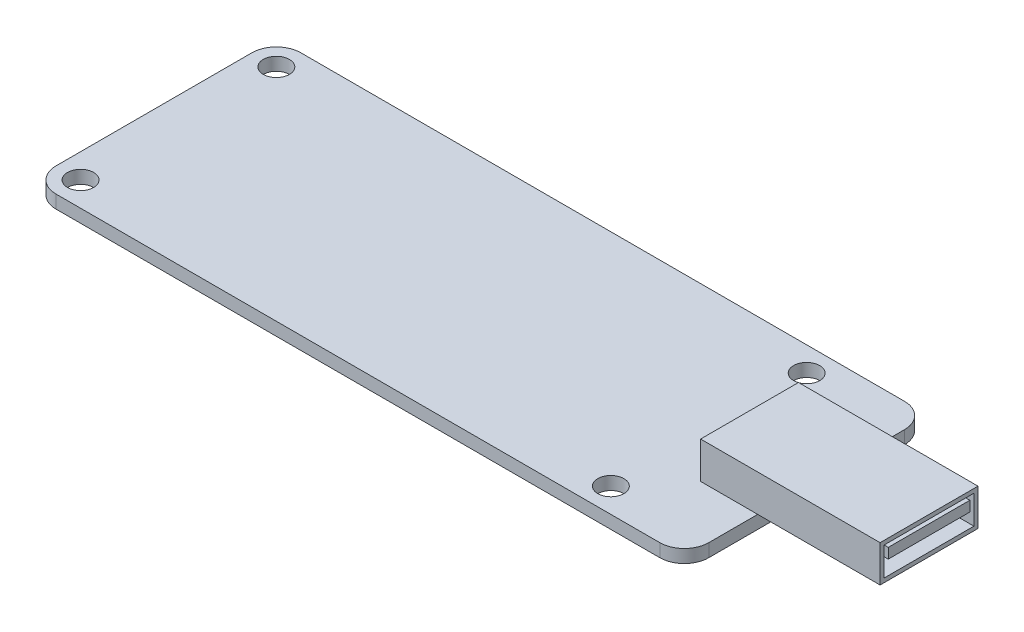
ISO-10303-21;
HEADER;
FILE_DESCRIPTION(('STEP AP214'),'2;1');
FILE_NAME('part.step','',(''),(''),'','','');
FILE_SCHEMA(('AUTOMOTIVE_DESIGN { 1 0 10303 214 1 1 1 1 }'));
ENDSEC;
DATA;
#1=APPLICATION_CONTEXT('core data for automotive mechanical design processes');
#2=APPLICATION_PROTOCOL_DEFINITION('international standard','automotive_design',2000,#1);
#3=PRODUCT_CONTEXT('',#1,'mechanical');
#4=PRODUCT('Part','Part','',(#3));
#5=PRODUCT_RELATED_PRODUCT_CATEGORY('part','',(#4));
#6=PRODUCT_DEFINITION_FORMATION('','',#4);
#7=PRODUCT_DEFINITION_CONTEXT('part definition',#1,'design');
#8=PRODUCT_DEFINITION('design','',#6,#7);
#9=PRODUCT_DEFINITION_SHAPE('','',#8);
#10=(LENGTH_UNIT() NAMED_UNIT(*) SI_UNIT(.MILLI.,.METRE.));
#11=(NAMED_UNIT(*) PLANE_ANGLE_UNIT() SI_UNIT($,.RADIAN.));
#12=(NAMED_UNIT(*) SI_UNIT($,.STERADIAN.) SOLID_ANGLE_UNIT());
#13=UNCERTAINTY_MEASURE_WITH_UNIT(LENGTH_MEASURE(1.E-05),#10,'distance_accuracy_value','');
#14=(GEOMETRIC_REPRESENTATION_CONTEXT(3) GLOBAL_UNCERTAINTY_ASSIGNED_CONTEXT((#13)) GLOBAL_UNIT_ASSIGNED_CONTEXT((#10,
#11,#12)) REPRESENTATION_CONTEXT('',''));
#15=CARTESIAN_POINT('',(0.,0.,0.));
#16=DIRECTION('',(0.,0.,1.));
#17=DIRECTION('',(1.,0.,0.));
#18=AXIS2_PLACEMENT_3D('',#15,#16,#17);
#19=CARTESIAN_POINT('',(40.,1.6,-15.));
#20=DIRECTION('',(-1.,0.,0.));
#21=DIRECTION('',(0.,0.,1.));
#22=AXIS2_PLACEMENT_3D('',#19,#20,#21);
#23=PLANE('',#22);
#24=DIRECTION('',(0.,0.,-1.));
#25=VECTOR('',#24,1.);
#26=CARTESIAN_POINT('',(40.,1.6,-15.));
#27=LINE('',#26,#25);
#28=CARTESIAN_POINT('',(40.,1.6,12.));
#29=VERTEX_POINT('',#28);
#30=CARTESIAN_POINT('',(40.,1.6,6.));
#31=VERTEX_POINT('',#30);
#32=EDGE_CURVE('E413',#29,#31,#27,.T.);
#33=ORIENTED_EDGE('',*,*,#32,.F.);
#34=DIRECTION('',(0.,-1.,0.));
#35=VECTOR('',#34,1.);
#36=CARTESIAN_POINT('',(40.,1.6,12.));
#37=LINE('',#36,#35);
#38=CARTESIAN_POINT('',(40.,0.,12.));
#39=VERTEX_POINT('',#38);
#40=EDGE_CURVE('E439',#29,#39,#37,.T.);
#41=ORIENTED_EDGE('',*,*,#40,.T.);
#42=DIRECTION('',(0.,0.,-1.));
#43=VECTOR('',#42,1.);
#44=CARTESIAN_POINT('',(40.,0.,-15.));
#45=LINE('',#44,#43);
#46=CARTESIAN_POINT('',(40.,0.,-12.));
#47=VERTEX_POINT('',#46);
#48=EDGE_CURVE('E412',#39,#47,#45,.T.);
#49=ORIENTED_EDGE('',*,*,#48,.T.);
#50=DIRECTION('',(0.,-1.,0.));
#51=VECTOR('',#50,1.);
#52=CARTESIAN_POINT('',(40.,1.6,-12.));
#53=LINE('',#52,#51);
#54=CARTESIAN_POINT('',(40.,1.6,-12.));
#55=VERTEX_POINT('',#54);
#56=EDGE_CURVE('E437',#47,#55,#53,.F.);
#57=ORIENTED_EDGE('',*,*,#56,.T.);
#58=CARTESIAN_POINT('',(40.,1.6,-6.));
#59=VERTEX_POINT('',#58);
#60=EDGE_CURVE('E417',#59,#55,#27,.T.);
#61=ORIENTED_EDGE('',*,*,#60,.F.);
#62=EDGE_CURVE('E416',#31,#59,#27,.T.);
#63=ORIENTED_EDGE('',*,*,#62,.F.);
#64=EDGE_LOOP('',(#33,#41,#49,#57,#61,#63));
#65=FACE_BOUND('',#64,.T.);
#66=ADVANCED_FACE('F35',(#65),#23,.F.);
#67=CARTESIAN_POINT('',(-40.,1.6,-15.));
#68=DIRECTION('',(0.,0.,1.));
#69=DIRECTION('',(1.,0.,0.));
#70=AXIS2_PLACEMENT_3D('',#67,#68,#69);
#71=PLANE('',#70);
#72=DIRECTION('',(-1.,0.,0.));
#73=VECTOR('',#72,1.);
#74=CARTESIAN_POINT('',(-40.,1.6,-15.));
#75=LINE('',#74,#73);
#76=CARTESIAN_POINT('',(37.,1.6,-15.));
#77=VERTEX_POINT('',#76);
#78=CARTESIAN_POINT('',(-37.,1.6,-15.));
#79=VERTEX_POINT('',#78);
#80=EDGE_CURVE('E415',#77,#79,#75,.T.);
#81=ORIENTED_EDGE('',*,*,#80,.F.);
#82=DIRECTION('',(0.,-1.,0.));
#83=VECTOR('',#82,1.);
#84=CARTESIAN_POINT('',(37.,1.6,-15.));
#85=LINE('',#84,#83);
#86=CARTESIAN_POINT('',(37.,0.,-15.));
#87=VERTEX_POINT('',#86);
#88=EDGE_CURVE('E465',#77,#87,#85,.T.);
#89=ORIENTED_EDGE('',*,*,#88,.T.);
#90=DIRECTION('',(-1.,0.,0.));
#91=VECTOR('',#90,1.);
#92=CARTESIAN_POINT('',(-40.,0.,-15.));
#93=LINE('',#92,#91);
#94=CARTESIAN_POINT('',(-37.,0.,-15.));
#95=VERTEX_POINT('',#94);
#96=EDGE_CURVE('E428',#87,#95,#93,.T.);
#97=ORIENTED_EDGE('',*,*,#96,.T.);
#98=DIRECTION('',(0.,-1.,0.));
#99=VECTOR('',#98,1.);
#100=CARTESIAN_POINT('',(-37.,1.6,-15.));
#101=LINE('',#100,#99);
#102=EDGE_CURVE('E463',#95,#79,#101,.F.);
#103=ORIENTED_EDGE('',*,*,#102,.T.);
#104=EDGE_LOOP('',(#81,#89,#97,#103));
#105=FACE_BOUND('',#104,.T.);
#106=ADVANCED_FACE('F534',(#105),#71,.F.);
#107=CARTESIAN_POINT('',(-40.,1.6,-15.));
#108=DIRECTION('',(1.,0.,0.));
#109=DIRECTION('',(0.,0.,-1.));
#110=AXIS2_PLACEMENT_3D('',#107,#108,#109);
#111=PLANE('',#110);
#112=DIRECTION('',(0.,0.,1.));
#113=VECTOR('',#112,1.);
#114=CARTESIAN_POINT('',(-40.,1.6,-15.));
#115=LINE('',#114,#113);
#116=CARTESIAN_POINT('',(-40.,1.6,-12.));
#117=VERTEX_POINT('',#116);
#118=CARTESIAN_POINT('',(-40.,1.6,12.));
#119=VERTEX_POINT('',#118);
#120=EDGE_CURVE('E420',#117,#119,#115,.T.);
#121=ORIENTED_EDGE('',*,*,#120,.F.);
#122=DIRECTION('',(0.,-1.,0.));
#123=VECTOR('',#122,1.);
#124=CARTESIAN_POINT('',(-40.,1.6,-12.));
#125=LINE('',#124,#123);
#126=CARTESIAN_POINT('',(-40.,0.,-12.));
#127=VERTEX_POINT('',#126);
#128=EDGE_CURVE('E11',#117,#127,#125,.T.);
#129=ORIENTED_EDGE('',*,*,#128,.T.);
#130=DIRECTION('',(0.,0.,1.));
#131=VECTOR('',#130,1.);
#132=CARTESIAN_POINT('',(-40.,0.,-15.));
#133=LINE('',#132,#131);
#134=CARTESIAN_POINT('',(-40.,0.,12.));
#135=VERTEX_POINT('',#134);
#136=EDGE_CURVE('E431',#127,#135,#133,.T.);
#137=ORIENTED_EDGE('',*,*,#136,.T.);
#138=DIRECTION('',(0.,-1.,0.));
#139=VECTOR('',#138,1.);
#140=CARTESIAN_POINT('',(-40.,1.6,12.));
#141=LINE('',#140,#139);
#142=EDGE_CURVE('E43',#135,#119,#141,.F.);
#143=ORIENTED_EDGE('',*,*,#142,.T.);
#144=EDGE_LOOP('',(#121,#129,#137,#143));
#145=FACE_BOUND('',#144,.T.);
#146=ADVANCED_FACE('F470',(#145),#111,.F.);
#147=CARTESIAN_POINT('',(-40.,1.6,15.));
#148=DIRECTION('',(0.,0.,-1.));
#149=DIRECTION('',(-1.,0.,0.));
#150=AXIS2_PLACEMENT_3D('',#147,#148,#149);
#151=PLANE('',#150);
#152=DIRECTION('',(1.,0.,0.));
#153=VECTOR('',#152,1.);
#154=CARTESIAN_POINT('',(-40.,0.,15.));
#155=LINE('',#154,#153);
#156=CARTESIAN_POINT('',(-37.,0.,15.));
#157=VERTEX_POINT('',#156);
#158=CARTESIAN_POINT('',(37.,0.,15.));
#159=VERTEX_POINT('',#158);
#160=EDGE_CURVE('E434',#157,#159,#155,.T.);
#161=ORIENTED_EDGE('',*,*,#160,.T.);
#162=DIRECTION('',(0.,-1.,0.));
#163=VECTOR('',#162,1.);
#164=CARTESIAN_POINT('',(37.,1.6,15.));
#165=LINE('',#164,#163);
#166=CARTESIAN_POINT('',(37.,1.6,15.));
#167=VERTEX_POINT('',#166);
#168=EDGE_CURVE('E453',#159,#167,#165,.F.);
#169=ORIENTED_EDGE('',*,*,#168,.T.);
#170=DIRECTION('',(1.,0.,0.));
#171=VECTOR('',#170,1.);
#172=CARTESIAN_POINT('',(-40.,1.6,15.));
#173=LINE('',#172,#171);
#174=CARTESIAN_POINT('',(-37.,1.6,15.));
#175=VERTEX_POINT('',#174);
#176=EDGE_CURVE('E423',#175,#167,#173,.T.);
#177=ORIENTED_EDGE('',*,*,#176,.F.);
#178=DIRECTION('',(0.,-1.,0.));
#179=VECTOR('',#178,1.);
#180=CARTESIAN_POINT('',(-37.,1.6,15.));
#181=LINE('',#180,#179);
#182=EDGE_CURVE('E450',#175,#157,#181,.T.);
#183=ORIENTED_EDGE('',*,*,#182,.T.);
#184=EDGE_LOOP('',(#161,#169,#177,#183));
#185=FACE_BOUND('',#184,.T.);
#186=ADVANCED_FACE('F482',(#185),#151,.F.);
#187=CARTESIAN_POINT('',(0.,1.6,0.));
#188=DIRECTION('',(0.,1.,0.));
#189=DIRECTION('',(0.,0.,1.));
#190=AXIS2_PLACEMENT_3D('',#187,#188,#189);
#191=PLANE('',#190);
#192=CARTESIAN_POINT('',(28.,1.6,-12.));
#193=DIRECTION('',(0.,1.,0.));
#194=DIRECTION('',(0.,0.,1.));
#195=AXIS2_PLACEMENT_3D('',#192,#193,#194);
#196=CIRCLE('',#195,1.6);
#197=CARTESIAN_POINT('',(28.,1.6,-10.4));
#198=VERTEX_POINT('',#197);
#199=EDGE_CURVE('E365',#198,#198,#196,.T.);
#200=ORIENTED_EDGE('',*,*,#199,.F.);
#201=EDGE_LOOP('',(#200));
#202=FACE_BOUND('',#201,.T.);
#203=CARTESIAN_POINT('',(-37.,1.6,12.));
#204=DIRECTION('',(0.,1.,0.));
#205=DIRECTION('',(0.,0.,-1.));
#206=AXIS2_PLACEMENT_3D('',#203,#204,#205);
#207=CIRCLE('',#206,1.6);
#208=CARTESIAN_POINT('',(-37.,1.6,10.4));
#209=VERTEX_POINT('',#208);
#210=EDGE_CURVE('E358',#209,#209,#207,.T.);
#211=ORIENTED_EDGE('',*,*,#210,.F.);
#212=EDGE_LOOP('',(#211));
#213=FACE_BOUND('',#212,.T.);
#214=CARTESIAN_POINT('',(28.,1.6,12.));
#215=DIRECTION('',(0.,1.,0.));
#216=DIRECTION('',(0.,0.,-1.));
#217=AXIS2_PLACEMENT_3D('',#214,#215,#216);
#218=CIRCLE('',#217,1.6);
#219=CARTESIAN_POINT('',(28.,1.6,10.4));
#220=VERTEX_POINT('',#219);
#221=EDGE_CURVE('E348',#220,#220,#218,.T.);
#222=ORIENTED_EDGE('',*,*,#221,.F.);
#223=EDGE_LOOP('',(#222));
#224=FACE_BOUND('',#223,.T.);
#225=CARTESIAN_POINT('',(-37.,1.6,-12.));
#226=DIRECTION('',(0.,1.,0.));
#227=DIRECTION('',(0.,0.,1.));
#228=AXIS2_PLACEMENT_3D('',#225,#226,#227);
#229=CIRCLE('',#228,1.6);
#230=CARTESIAN_POINT('',(-37.,1.6,-10.4));
#231=VERTEX_POINT('',#230);
#232=EDGE_CURVE('E364',#231,#231,#229,.T.);
#233=ORIENTED_EDGE('',*,*,#232,.F.);
#234=EDGE_LOOP('',(#233));
#235=FACE_BOUND('',#234,.T.);
#236=ORIENTED_EDGE('',*,*,#176,.T.);
#237=CARTESIAN_POINT('',(37.,1.6,12.));
#238=DIRECTION('',(0.,1.,0.));
#239=DIRECTION('',(0.,0.,1.));
#240=AXIS2_PLACEMENT_3D('',#237,#238,#239);
#241=CIRCLE('',#240,3.);
#242=EDGE_CURVE('E461',#167,#29,#241,.T.);
#243=ORIENTED_EDGE('',*,*,#242,.T.);
#244=ORIENTED_EDGE('',*,*,#32,.T.);
#245=DIRECTION('',(1.,0.,0.));
#246=VECTOR('',#245,1.);
#247=CARTESIAN_POINT('',(33.,1.6,6.));
#248=LINE('',#247,#246);
#249=CARTESIAN_POINT('',(33.,1.6,6.));
#250=VERTEX_POINT('',#249);
#251=EDGE_CURVE('E393',#250,#31,#248,.T.);
#252=ORIENTED_EDGE('',*,*,#251,.F.);
#253=DIRECTION('',(0.,0.,1.));
#254=VECTOR('',#253,1.);
#255=CARTESIAN_POINT('',(33.,1.6,-6.));
#256=LINE('',#255,#254);
#257=CARTESIAN_POINT('',(33.,1.6,-6.));
#258=VERTEX_POINT('',#257);
#259=EDGE_CURVE('E376',#258,#250,#256,.T.);
#260=ORIENTED_EDGE('',*,*,#259,.F.);
#261=DIRECTION('',(-1.,0.,0.));
#262=VECTOR('',#261,1.);
#263=CARTESIAN_POINT('',(33.,1.6,-6.));
#264=LINE('',#263,#262);
#265=EDGE_CURVE('E400',#59,#258,#264,.T.);
#266=ORIENTED_EDGE('',*,*,#265,.F.);
#267=ORIENTED_EDGE('',*,*,#60,.T.);
#268=CARTESIAN_POINT('',(37.,1.6,-12.));
#269=DIRECTION('',(0.,1.,0.));
#270=DIRECTION('',(0.,0.,1.));
#271=AXIS2_PLACEMENT_3D('',#268,#269,#270);
#272=CIRCLE('',#271,3.);
#273=EDGE_CURVE('E459',#55,#77,#272,.T.);
#274=ORIENTED_EDGE('',*,*,#273,.T.);
#275=ORIENTED_EDGE('',*,*,#80,.T.);
#276=CARTESIAN_POINT('',(-37.,1.6,-12.));
#277=DIRECTION('',(0.,1.,0.));
#278=DIRECTION('',(0.,0.,1.));
#279=AXIS2_PLACEMENT_3D('',#276,#277,#278);
#280=CIRCLE('',#279,3.);
#281=EDGE_CURVE('E457',#79,#117,#280,.T.);
#282=ORIENTED_EDGE('',*,*,#281,.T.);
#283=ORIENTED_EDGE('',*,*,#120,.T.);
#284=CARTESIAN_POINT('',(-37.,1.6,12.));
#285=DIRECTION('',(0.,1.,0.));
#286=DIRECTION('',(0.,0.,1.));
#287=AXIS2_PLACEMENT_3D('',#284,#285,#286);
#288=CIRCLE('',#287,3.);
#289=EDGE_CURVE('E455',#119,#175,#288,.T.);
#290=ORIENTED_EDGE('',*,*,#289,.T.);
#291=EDGE_LOOP('',(#236,#243,#244,#252,#260,#266,#267,#274,#275,#282,#283,#290));
#292=FACE_BOUND('',#291,.T.);
#293=ADVANCED_FACE('F476',(#202,#213,#224,#235,#292),#191,.T.);
#294=CARTESIAN_POINT('',(0.,0.,0.));
#295=DIRECTION('',(0.,1.,0.));
#296=DIRECTION('',(0.,0.,1.));
#297=AXIS2_PLACEMENT_3D('',#294,#295,#296);
#298=PLANE('',#297);
#299=CARTESIAN_POINT('',(28.,0.,-12.));
#300=DIRECTION('',(0.,1.,0.));
#301=DIRECTION('',(0.,0.,1.));
#302=AXIS2_PLACEMENT_3D('',#299,#300,#301);
#303=CIRCLE('',#302,1.6);
#304=CARTESIAN_POINT('',(28.,0.,-10.4));
#305=VERTEX_POINT('',#304);
#306=EDGE_CURVE('E361',#305,#305,#303,.T.);
#307=ORIENTED_EDGE('',*,*,#306,.T.);
#308=EDGE_LOOP('',(#307));
#309=FACE_BOUND('',#308,.T.);
#310=CARTESIAN_POINT('',(-37.,0.,12.));
#311=DIRECTION('',(0.,1.,0.));
#312=DIRECTION('',(0.,0.,-1.));
#313=AXIS2_PLACEMENT_3D('',#310,#311,#312);
#314=CIRCLE('',#313,1.6);
#315=CARTESIAN_POINT('',(-37.,0.,10.4));
#316=VERTEX_POINT('',#315);
#317=EDGE_CURVE('E368',#316,#316,#314,.T.);
#318=ORIENTED_EDGE('',*,*,#317,.T.);
#319=EDGE_LOOP('',(#318));
#320=FACE_BOUND('',#319,.T.);
#321=CARTESIAN_POINT('',(28.,0.,12.));
#322=DIRECTION('',(0.,1.,0.));
#323=DIRECTION('',(0.,0.,-1.));
#324=AXIS2_PLACEMENT_3D('',#321,#322,#323);
#325=CIRCLE('',#324,1.6);
#326=CARTESIAN_POINT('',(28.,0.,10.4));
#327=VERTEX_POINT('',#326);
#328=EDGE_CURVE('E355',#327,#327,#325,.T.);
#329=ORIENTED_EDGE('',*,*,#328,.T.);
#330=EDGE_LOOP('',(#329));
#331=FACE_BOUND('',#330,.T.);
#332=CARTESIAN_POINT('',(-37.,0.,-12.));
#333=DIRECTION('',(0.,1.,0.));
#334=DIRECTION('',(0.,0.,1.));
#335=AXIS2_PLACEMENT_3D('',#332,#333,#334);
#336=CIRCLE('',#335,1.6);
#337=CARTESIAN_POINT('',(-37.,0.,-10.4));
#338=VERTEX_POINT('',#337);
#339=EDGE_CURVE('E373',#338,#338,#336,.T.);
#340=ORIENTED_EDGE('',*,*,#339,.T.);
#341=EDGE_LOOP('',(#340));
#342=FACE_BOUND('',#341,.T.);
#343=ORIENTED_EDGE('',*,*,#48,.F.);
#344=CARTESIAN_POINT('',(37.,0.,12.));
#345=DIRECTION('',(0.,1.,0.));
#346=DIRECTION('',(0.,0.,1.));
#347=AXIS2_PLACEMENT_3D('',#344,#345,#346);
#348=CIRCLE('',#347,3.);
#349=EDGE_CURVE('E448',#39,#159,#348,.F.);
#350=ORIENTED_EDGE('',*,*,#349,.T.);
#351=ORIENTED_EDGE('',*,*,#160,.F.);
#352=CARTESIAN_POINT('',(-37.,0.,12.));
#353=DIRECTION('',(0.,1.,0.));
#354=DIRECTION('',(0.,0.,1.));
#355=AXIS2_PLACEMENT_3D('',#352,#353,#354);
#356=CIRCLE('',#355,3.);
#357=EDGE_CURVE('E442',#157,#135,#356,.F.);
#358=ORIENTED_EDGE('',*,*,#357,.T.);
#359=ORIENTED_EDGE('',*,*,#136,.F.);
#360=CARTESIAN_POINT('',(-37.,0.,-12.));
#361=DIRECTION('',(0.,1.,0.));
#362=DIRECTION('',(0.,0.,1.));
#363=AXIS2_PLACEMENT_3D('',#360,#361,#362);
#364=CIRCLE('',#363,3.);
#365=EDGE_CURVE('E444',#127,#95,#364,.F.);
#366=ORIENTED_EDGE('',*,*,#365,.T.);
#367=ORIENTED_EDGE('',*,*,#96,.F.);
#368=CARTESIAN_POINT('',(37.,0.,-12.));
#369=DIRECTION('',(0.,1.,0.));
#370=DIRECTION('',(0.,0.,1.));
#371=AXIS2_PLACEMENT_3D('',#368,#369,#370);
#372=CIRCLE('',#371,3.);
#373=EDGE_CURVE('E446',#87,#47,#372,.F.);
#374=ORIENTED_EDGE('',*,*,#373,.T.);
#375=EDGE_LOOP('',(#343,#350,#351,#358,#359,#366,#367,#374));
#376=FACE_BOUND('',#375,.T.);
#377=ADVANCED_FACE('F486',(#309,#320,#331,#342,#376),#298,.F.);
#378=CARTESIAN_POINT('',(0.,1.6,0.));
#379=DIRECTION('',(0.,1.,0.));
#380=DIRECTION('',(0.,0.,1.));
#381=AXIS2_PLACEMENT_3D('',#378,#379,#380);
#382=PLANE('',#381);
#383=DIRECTION('',(1.,0.,0.));
#384=VECTOR('',#383,1.);
#385=CARTESIAN_POINT('',(49.5,1.6,-3.5));
#386=LINE('',#385,#384);
#387=CARTESIAN_POINT('',(49.5,1.6,-3.5));
#388=VERTEX_POINT('',#387);
#389=CARTESIAN_POINT('',(51.,1.6,-3.5));
#390=VERTEX_POINT('',#389);
#391=EDGE_CURVE('E243',#388,#390,#386,.T.);
#392=ORIENTED_EDGE('',*,*,#391,.F.);
#393=DIRECTION('',(0.,0.,-1.));
#394=VECTOR('',#393,1.);
#395=CARTESIAN_POINT('',(49.5,1.6,-3.5));
#396=LINE('',#395,#394);
#397=CARTESIAN_POINT('',(49.5,1.6,-2.));
#398=VERTEX_POINT('',#397);
#399=EDGE_CURVE('E50',#398,#388,#396,.T.);
#400=ORIENTED_EDGE('',*,*,#399,.F.);
#401=DIRECTION('',(-1.,0.,0.));
#402=VECTOR('',#401,1.);
#403=CARTESIAN_POINT('',(49.5,1.6,-2.));
#404=LINE('',#403,#402);
#405=CARTESIAN_POINT('',(51.,1.6,-2.));
#406=VERTEX_POINT('',#405);
#407=EDGE_CURVE('E250',#406,#398,#404,.T.);
#408=ORIENTED_EDGE('',*,*,#407,.F.);
#409=DIRECTION('',(0.,0.,1.));
#410=VECTOR('',#409,1.);
#411=CARTESIAN_POINT('',(51.,1.6,-3.5));
#412=LINE('',#411,#410);
#413=EDGE_CURVE('E233',#390,#406,#412,.T.);
#414=ORIENTED_EDGE('',*,*,#413,.F.);
#415=EDGE_LOOP('',(#392,#400,#408,#414));
#416=FACE_BOUND('',#415,.T.);
#417=DIRECTION('',(1.,0.,0.));
#418=VECTOR('',#417,1.);
#419=CARTESIAN_POINT('',(49.5,1.6,2.));
#420=LINE('',#419,#418);
#421=CARTESIAN_POINT('',(49.5,1.6,2.));
#422=VERTEX_POINT('',#421);
#423=CARTESIAN_POINT('',(51.,1.6,2.));
#424=VERTEX_POINT('',#423);
#425=EDGE_CURVE('E273',#422,#424,#420,.T.);
#426=ORIENTED_EDGE('',*,*,#425,.F.);
#427=DIRECTION('',(0.,0.,-1.));
#428=VECTOR('',#427,1.);
#429=CARTESIAN_POINT('',(49.5,1.6,3.5));
#430=LINE('',#429,#428);
#431=CARTESIAN_POINT('',(49.5,1.6,3.5));
#432=VERTEX_POINT('',#431);
#433=EDGE_CURVE('E58',#432,#422,#430,.T.);
#434=ORIENTED_EDGE('',*,*,#433,.F.);
#435=DIRECTION('',(-1.,0.,0.));
#436=VECTOR('',#435,1.);
#437=CARTESIAN_POINT('',(49.5,1.6,3.5));
#438=LINE('',#437,#436);
#439=CARTESIAN_POINT('',(51.,1.6,3.5));
#440=VERTEX_POINT('',#439);
#441=EDGE_CURVE('E279',#440,#432,#438,.T.);
#442=ORIENTED_EDGE('',*,*,#441,.F.);
#443=DIRECTION('',(0.,0.,1.));
#444=VECTOR('',#443,1.);
#445=CARTESIAN_POINT('',(51.,1.6,3.5));
#446=LINE('',#445,#444);
#447=EDGE_CURVE('E276',#424,#440,#446,.T.);
#448=ORIENTED_EDGE('',*,*,#447,.F.);
#449=EDGE_LOOP('',(#426,#434,#442,#448));
#450=FACE_BOUND('',#449,.T.);
#451=CARTESIAN_POINT('',(55.,1.6,6.));
#452=VERTEX_POINT('',#451);
#453=EDGE_CURVE('E392',#31,#452,#248,.T.);
#454=ORIENTED_EDGE('',*,*,#453,.F.);
#455=ORIENTED_EDGE('',*,*,#62,.T.);
#456=CARTESIAN_POINT('',(55.,1.6,-6.));
#457=VERTEX_POINT('',#456);
#458=EDGE_CURVE('E383',#457,#59,#264,.T.);
#459=ORIENTED_EDGE('',*,*,#458,.F.);
#460=DIRECTION('',(0.,0.,-1.));
#461=VECTOR('',#460,1.);
#462=CARTESIAN_POINT('',(55.,1.6,-6.));
#463=LINE('',#462,#461);
#464=EDGE_CURVE('E396',#452,#457,#463,.T.);
#465=ORIENTED_EDGE('',*,*,#464,.F.);
#466=EDGE_LOOP('',(#454,#455,#459,#465));
#467=FACE_BOUND('',#466,.T.);
#468=ADVANCED_FACE('F247',(#416,#450,#467),#382,.F.);
#469=CARTESIAN_POINT('',(33.,6.1,-6.));
#470=DIRECTION('',(1.,0.,0.));
#471=DIRECTION('',(0.,0.,-1.));
#472=AXIS2_PLACEMENT_3D('',#469,#470,#471);
#473=PLANE('',#472);
#474=ORIENTED_EDGE('',*,*,#259,.T.);
#475=DIRECTION('',(0.,-1.,0.));
#476=VECTOR('',#475,1.);
#477=CARTESIAN_POINT('',(33.,6.1,6.));
#478=LINE('',#477,#476);
#479=CARTESIAN_POINT('',(33.,6.1,6.));
#480=VERTEX_POINT('',#479);
#481=EDGE_CURVE('E409',#480,#250,#478,.T.);
#482=ORIENTED_EDGE('',*,*,#481,.F.);
#483=DIRECTION('',(0.,0.,1.));
#484=VECTOR('',#483,1.);
#485=CARTESIAN_POINT('',(33.,6.1,-6.));
#486=LINE('',#485,#484);
#487=CARTESIAN_POINT('',(33.,6.1,-6.));
#488=VERTEX_POINT('',#487);
#489=EDGE_CURVE('E379',#488,#480,#486,.T.);
#490=ORIENTED_EDGE('',*,*,#489,.F.);
#491=DIRECTION('',(0.,-1.,0.));
#492=VECTOR('',#491,1.);
#493=CARTESIAN_POINT('',(33.,6.1,-6.));
#494=LINE('',#493,#492);
#495=EDGE_CURVE('E389',#488,#258,#494,.T.);
#496=ORIENTED_EDGE('',*,*,#495,.T.);
#497=EDGE_LOOP('',(#474,#482,#490,#496));
#498=FACE_BOUND('',#497,.T.);
#499=ADVANCED_FACE('F505',(#498),#473,.F.);
#500=CARTESIAN_POINT('',(33.,6.1,6.));
#501=DIRECTION('',(0.,0.,-1.));
#502=DIRECTION('',(-1.,0.,0.));
#503=AXIS2_PLACEMENT_3D('',#500,#501,#502);
#504=PLANE('',#503);
#505=ORIENTED_EDGE('',*,*,#251,.T.);
#506=ORIENTED_EDGE('',*,*,#453,.T.);
#507=DIRECTION('',(0.,-1.,0.));
#508=VECTOR('',#507,1.);
#509=CARTESIAN_POINT('',(55.,6.1,6.));
#510=LINE('',#509,#508);
#511=CARTESIAN_POINT('',(55.,6.1,6.));
#512=VERTEX_POINT('',#511);
#513=EDGE_CURVE('E406',#512,#452,#510,.T.);
#514=ORIENTED_EDGE('',*,*,#513,.F.);
#515=DIRECTION('',(1.,0.,0.));
#516=VECTOR('',#515,1.);
#517=CARTESIAN_POINT('',(33.,6.1,6.));
#518=LINE('',#517,#516);
#519=EDGE_CURVE('E382',#480,#512,#518,.T.);
#520=ORIENTED_EDGE('',*,*,#519,.F.);
#521=ORIENTED_EDGE('',*,*,#481,.T.);
#522=EDGE_LOOP('',(#505,#506,#514,#520,#521));
#523=FACE_BOUND('',#522,.T.);
#524=ADVANCED_FACE('F501',(#523),#504,.F.);
#525=CARTESIAN_POINT('',(55.,6.1,-6.));
#526=DIRECTION('',(-1.,0.,0.));
#527=DIRECTION('',(0.,0.,1.));
#528=AXIS2_PLACEMENT_3D('',#525,#526,#527);
#529=PLANE('',#528);
#530=DIRECTION('',(0.,0.,-1.));
#531=VECTOR('',#530,1.);
#532=CARTESIAN_POINT('',(55.,2.1,5.5));
#533=LINE('',#532,#531);
#534=CARTESIAN_POINT('',(55.,2.1,5.5));
#535=VERTEX_POINT('',#534);
#536=CARTESIAN_POINT('',(55.,2.1,-5.5));
#537=VERTEX_POINT('',#536);
#538=EDGE_CURVE('E338',#535,#537,#533,.T.);
#539=ORIENTED_EDGE('',*,*,#538,.F.);
#540=DIRECTION('',(0.,-1.,0.));
#541=VECTOR('',#540,1.);
#542=CARTESIAN_POINT('',(55.,5.6,5.5));
#543=LINE('',#542,#541);
#544=CARTESIAN_POINT('',(55.,5.6,5.5));
#545=VERTEX_POINT('',#544);
#546=EDGE_CURVE('E316',#545,#535,#543,.T.);
#547=ORIENTED_EDGE('',*,*,#546,.F.);
#548=DIRECTION('',(0.,0.,1.));
#549=VECTOR('',#548,1.);
#550=CARTESIAN_POINT('',(55.,5.6,5.5));
#551=LINE('',#550,#549);
#552=CARTESIAN_POINT('',(55.,5.6,-5.5));
#553=VERTEX_POINT('',#552);
#554=EDGE_CURVE('E327',#553,#545,#551,.T.);
#555=ORIENTED_EDGE('',*,*,#554,.F.);
#556=DIRECTION('',(0.,1.,0.));
#557=VECTOR('',#556,1.);
#558=CARTESIAN_POINT('',(55.,5.6,-5.5));
#559=LINE('',#558,#557);
#560=EDGE_CURVE('E341',#537,#553,#559,.T.);
#561=ORIENTED_EDGE('',*,*,#560,.F.);
#562=EDGE_LOOP('',(#539,#547,#555,#561));
#563=FACE_BOUND('',#562,.T.);
#564=ORIENTED_EDGE('',*,*,#464,.T.);
#565=DIRECTION('',(0.,-1.,0.));
#566=VECTOR('',#565,1.);
#567=CARTESIAN_POINT('',(55.,6.1,-6.));
#568=LINE('',#567,#566);
#569=CARTESIAN_POINT('',(55.,6.1,-6.));
#570=VERTEX_POINT('',#569);
#571=EDGE_CURVE('E403',#570,#457,#568,.T.);
#572=ORIENTED_EDGE('',*,*,#571,.F.);
#573=DIRECTION('',(0.,0.,-1.));
#574=VECTOR('',#573,1.);
#575=CARTESIAN_POINT('',(55.,6.1,-6.));
#576=LINE('',#575,#574);
#577=EDGE_CURVE('E385',#512,#570,#576,.T.);
#578=ORIENTED_EDGE('',*,*,#577,.F.);
#579=ORIENTED_EDGE('',*,*,#513,.T.);
#580=EDGE_LOOP('',(#564,#572,#578,#579));
#581=FACE_BOUND('',#580,.T.);
#582=ADVANCED_FACE('F517',(#563,#581),#529,.F.);
#583=CARTESIAN_POINT('',(33.,6.1,-6.));
#584=DIRECTION('',(0.,0.,1.));
#585=DIRECTION('',(1.,0.,0.));
#586=AXIS2_PLACEMENT_3D('',#583,#584,#585);
#587=PLANE('',#586);
#588=ORIENTED_EDGE('',*,*,#458,.T.);
#589=ORIENTED_EDGE('',*,*,#265,.T.);
#590=ORIENTED_EDGE('',*,*,#495,.F.);
#591=DIRECTION('',(-1.,0.,0.));
#592=VECTOR('',#591,1.);
#593=CARTESIAN_POINT('',(33.,6.1,-6.));
#594=LINE('',#593,#592);
#595=EDGE_CURVE('E387',#570,#488,#594,.T.);
#596=ORIENTED_EDGE('',*,*,#595,.F.);
#597=ORIENTED_EDGE('',*,*,#571,.T.);
#598=EDGE_LOOP('',(#588,#589,#590,#596,#597));
#599=FACE_BOUND('',#598,.T.);
#600=ADVANCED_FACE('F509',(#599),#587,.F.);
#601=CARTESIAN_POINT('',(0.,6.1,0.));
#602=DIRECTION('',(0.,1.,0.));
#603=DIRECTION('',(0.,0.,1.));
#604=AXIS2_PLACEMENT_3D('',#601,#602,#603);
#605=PLANE('',#604);
#606=ORIENTED_EDGE('',*,*,#489,.T.);
#607=ORIENTED_EDGE('',*,*,#519,.T.);
#608=ORIENTED_EDGE('',*,*,#577,.T.);
#609=ORIENTED_EDGE('',*,*,#595,.T.);
#610=EDGE_LOOP('',(#606,#607,#608,#609));
#611=FACE_BOUND('',#610,.T.);
#612=ADVANCED_FACE('F520',(#611),#605,.T.);
#613=CARTESIAN_POINT('',(-37.,0.,-12.));
#614=DIRECTION('',(0.,1.,0.));
#615=DIRECTION('',(0.,0.,1.));
#616=AXIS2_PLACEMENT_3D('',#613,#614,#615);
#617=CYLINDRICAL_SURFACE('',#616,1.6);
#618=ORIENTED_EDGE('',*,*,#339,.F.);
#619=EDGE_LOOP('',(#618));
#620=FACE_BOUND('',#619,.T.);
#621=ORIENTED_EDGE('',*,*,#232,.T.);
#622=EDGE_LOOP('',(#621));
#623=FACE_BOUND('',#622,.T.);
#624=ADVANCED_FACE('F522',(#620,#623),#617,.F.);
#625=CARTESIAN_POINT('',(28.,0.,12.));
#626=DIRECTION('',(0.,1.,0.));
#627=DIRECTION('',(0.,0.,1.));
#628=AXIS2_PLACEMENT_3D('',#625,#626,#627);
#629=CYLINDRICAL_SURFACE('',#628,1.6);
#630=ORIENTED_EDGE('',*,*,#328,.F.);
#631=EDGE_LOOP('',(#630));
#632=FACE_BOUND('',#631,.T.);
#633=ORIENTED_EDGE('',*,*,#221,.T.);
#634=EDGE_LOOP('',(#633));
#635=FACE_BOUND('',#634,.T.);
#636=ADVANCED_FACE('F528',(#632,#635),#629,.F.);
#637=CARTESIAN_POINT('',(-37.,0.,12.));
#638=DIRECTION('',(0.,1.,0.));
#639=DIRECTION('',(0.,0.,1.));
#640=AXIS2_PLACEMENT_3D('',#637,#638,#639);
#641=CYLINDRICAL_SURFACE('',#640,1.6);
#642=ORIENTED_EDGE('',*,*,#317,.F.);
#643=EDGE_LOOP('',(#642));
#644=FACE_BOUND('',#643,.T.);
#645=ORIENTED_EDGE('',*,*,#210,.T.);
#646=EDGE_LOOP('',(#645));
#647=FACE_BOUND('',#646,.T.);
#648=ADVANCED_FACE('F614',(#644,#647),#641,.F.);
#649=CARTESIAN_POINT('',(28.,0.,-12.));
#650=DIRECTION('',(0.,1.,0.));
#651=DIRECTION('',(0.,0.,1.));
#652=AXIS2_PLACEMENT_3D('',#649,#650,#651);
#653=CYLINDRICAL_SURFACE('',#652,1.6);
#654=ORIENTED_EDGE('',*,*,#306,.F.);
#655=EDGE_LOOP('',(#654));
#656=FACE_BOUND('',#655,.T.);
#657=ORIENTED_EDGE('',*,*,#199,.T.);
#658=EDGE_LOOP('',(#657));
#659=FACE_BOUND('',#658,.T.);
#660=ADVANCED_FACE('F610',(#656,#659),#653,.F.);
#661=CARTESIAN_POINT('',(43.,5.6,5.5));
#662=DIRECTION('',(0.,0.,1.));
#663=DIRECTION('',(1.,0.,0.));
#664=AXIS2_PLACEMENT_3D('',#661,#662,#663);
#665=PLANE('',#664);
#666=ORIENTED_EDGE('',*,*,#546,.T.);
#667=DIRECTION('',(1.,0.,0.));
#668=VECTOR('',#667,1.);
#669=CARTESIAN_POINT('',(43.,2.1,5.5));
#670=LINE('',#669,#668);
#671=CARTESIAN_POINT('',(43.,2.1,5.5));
#672=VERTEX_POINT('',#671);
#673=EDGE_CURVE('E336',#672,#535,#670,.T.);
#674=ORIENTED_EDGE('',*,*,#673,.F.);
#675=DIRECTION('',(0.,-1.,0.));
#676=VECTOR('',#675,1.);
#677=CARTESIAN_POINT('',(43.,5.6,5.5));
#678=LINE('',#677,#676);
#679=CARTESIAN_POINT('',(43.,5.6,5.5));
#680=VERTEX_POINT('',#679);
#681=EDGE_CURVE('E323',#680,#672,#678,.T.);
#682=ORIENTED_EDGE('',*,*,#681,.F.);
#683=DIRECTION('',(1.,0.,0.));
#684=VECTOR('',#683,1.);
#685=CARTESIAN_POINT('',(43.,5.6,5.5));
#686=LINE('',#685,#684);
#687=EDGE_CURVE('E346',#680,#545,#686,.T.);
#688=ORIENTED_EDGE('',*,*,#687,.T.);
#689=EDGE_LOOP('',(#666,#674,#682,#688));
#690=FACE_BOUND('',#689,.T.);
#691=ADVANCED_FACE('F600',(#690),#665,.F.);
#692=CARTESIAN_POINT('',(43.,5.6,5.5));
#693=DIRECTION('',(0.,1.,0.));
#694=DIRECTION('',(0.,0.,1.));
#695=AXIS2_PLACEMENT_3D('',#692,#693,#694);
#696=PLANE('',#695);
#697=ORIENTED_EDGE('',*,*,#554,.T.);
#698=ORIENTED_EDGE('',*,*,#687,.F.);
#699=DIRECTION('',(0.,0.,1.));
#700=VECTOR('',#699,1.);
#701=CARTESIAN_POINT('',(43.,5.6,5.5));
#702=LINE('',#701,#700);
#703=CARTESIAN_POINT('',(43.,5.6,-5.5));
#704=VERTEX_POINT('',#703);
#705=EDGE_CURVE('E333',#704,#680,#702,.T.);
#706=ORIENTED_EDGE('',*,*,#705,.F.);
#707=DIRECTION('',(1.,0.,0.));
#708=VECTOR('',#707,1.);
#709=CARTESIAN_POINT('',(43.,5.6,-5.5));
#710=LINE('',#709,#708);
#711=EDGE_CURVE('E349',#704,#553,#710,.T.);
#712=ORIENTED_EDGE('',*,*,#711,.T.);
#713=EDGE_LOOP('',(#697,#698,#706,#712));
#714=FACE_BOUND('',#713,.T.);
#715=ADVANCED_FACE('F596',(#714),#696,.F.);
#716=CARTESIAN_POINT('',(43.,5.6,-5.5));
#717=DIRECTION('',(0.,0.,-1.));
#718=DIRECTION('',(-1.,0.,0.));
#719=AXIS2_PLACEMENT_3D('',#716,#717,#718);
#720=PLANE('',#719);
#721=ORIENTED_EDGE('',*,*,#560,.T.);
#722=ORIENTED_EDGE('',*,*,#711,.F.);
#723=DIRECTION('',(0.,1.,0.));
#724=VECTOR('',#723,1.);
#725=CARTESIAN_POINT('',(43.,5.6,-5.5));
#726=LINE('',#725,#724);
#727=CARTESIAN_POINT('',(43.,2.1,-5.5));
#728=VERTEX_POINT('',#727);
#729=EDGE_CURVE('E330',#728,#704,#726,.T.);
#730=ORIENTED_EDGE('',*,*,#729,.F.);
#731=DIRECTION('',(1.,0.,0.));
#732=VECTOR('',#731,1.);
#733=CARTESIAN_POINT('',(43.,2.1,-5.5));
#734=LINE('',#733,#732);
#735=EDGE_CURVE('E351',#728,#537,#734,.T.);
#736=ORIENTED_EDGE('',*,*,#735,.T.);
#737=EDGE_LOOP('',(#721,#722,#730,#736));
#738=FACE_BOUND('',#737,.T.);
#739=ADVANCED_FACE('F599',(#738),#720,.F.);
#740=CARTESIAN_POINT('',(43.,2.1,5.5));
#741=DIRECTION('',(0.,-1.,0.));
#742=DIRECTION('',(0.,0.,-1.));
#743=AXIS2_PLACEMENT_3D('',#740,#741,#742);
#744=PLANE('',#743);
#745=DIRECTION('',(1.,0.,0.));
#746=VECTOR('',#745,1.);
#747=CARTESIAN_POINT('',(49.5,2.1,-2.));
#748=LINE('',#747,#746);
#749=CARTESIAN_POINT('',(49.5,2.1,-2.));
#750=VERTEX_POINT('',#749);
#751=CARTESIAN_POINT('',(51.,2.1,-2.));
#752=VERTEX_POINT('',#751);
#753=EDGE_CURVE('E914',#750,#752,#748,.T.);
#754=ORIENTED_EDGE('',*,*,#753,.F.);
#755=DIRECTION('',(0.,0.,1.));
#756=VECTOR('',#755,1.);
#757=CARTESIAN_POINT('',(49.5,2.1,-3.5));
#758=LINE('',#757,#756);
#759=CARTESIAN_POINT('',(49.5,2.1,-3.5));
#760=VERTEX_POINT('',#759);
#761=EDGE_CURVE('E262',#760,#750,#758,.T.);
#762=ORIENTED_EDGE('',*,*,#761,.F.);
#763=DIRECTION('',(-1.,0.,0.));
#764=VECTOR('',#763,1.);
#765=CARTESIAN_POINT('',(49.5,2.1,-3.5));
#766=LINE('',#765,#764);
#767=CARTESIAN_POINT('',(51.,2.1,-3.5));
#768=VERTEX_POINT('',#767);
#769=EDGE_CURVE('E259',#768,#760,#766,.T.);
#770=ORIENTED_EDGE('',*,*,#769,.F.);
#771=DIRECTION('',(0.,0.,-1.));
#772=VECTOR('',#771,1.);
#773=CARTESIAN_POINT('',(51.,2.1,-3.5));
#774=LINE('',#773,#772);
#775=EDGE_CURVE('E236',#752,#768,#774,.T.);
#776=ORIENTED_EDGE('',*,*,#775,.F.);
#777=EDGE_LOOP('',(#754,#762,#770,#776));
#778=FACE_BOUND('',#777,.T.);
#779=DIRECTION('',(1.,0.,0.));
#780=VECTOR('',#779,1.);
#781=CARTESIAN_POINT('',(49.5,2.1,3.5));
#782=LINE('',#781,#780);
#783=CARTESIAN_POINT('',(49.5,2.1,3.5));
#784=VERTEX_POINT('',#783);
#785=CARTESIAN_POINT('',(51.,2.1,3.5));
#786=VERTEX_POINT('',#785);
#787=EDGE_CURVE('E266',#784,#786,#782,.T.);
#788=ORIENTED_EDGE('',*,*,#787,.F.);
#789=DIRECTION('',(0.,0.,1.));
#790=VECTOR('',#789,1.);
#791=CARTESIAN_POINT('',(49.5,2.1,3.5));
#792=LINE('',#791,#790);
#793=CARTESIAN_POINT('',(49.5,2.1,2.));
#794=VERTEX_POINT('',#793);
#795=EDGE_CURVE('E269',#794,#784,#792,.T.);
#796=ORIENTED_EDGE('',*,*,#795,.F.);
#797=DIRECTION('',(-1.,0.,0.));
#798=VECTOR('',#797,1.);
#799=CARTESIAN_POINT('',(49.5,2.1,2.));
#800=LINE('',#799,#798);
#801=CARTESIAN_POINT('',(51.,2.1,2.));
#802=VERTEX_POINT('',#801);
#803=EDGE_CURVE('E271',#802,#794,#800,.T.);
#804=ORIENTED_EDGE('',*,*,#803,.F.);
#805=DIRECTION('',(0.,0.,-1.));
#806=VECTOR('',#805,1.);
#807=CARTESIAN_POINT('',(51.,2.1,3.5));
#808=LINE('',#807,#806);
#809=EDGE_CURVE('E263',#786,#802,#808,.T.);
#810=ORIENTED_EDGE('',*,*,#809,.F.);
#811=EDGE_LOOP('',(#788,#796,#804,#810));
#812=FACE_BOUND('',#811,.T.);
#813=ORIENTED_EDGE('',*,*,#538,.T.);
#814=ORIENTED_EDGE('',*,*,#735,.F.);
#815=DIRECTION('',(0.,0.,-1.));
#816=VECTOR('',#815,1.);
#817=CARTESIAN_POINT('',(43.,2.1,5.5));
#818=LINE('',#817,#816);
#819=EDGE_CURVE('E326',#672,#728,#818,.T.);
#820=ORIENTED_EDGE('',*,*,#819,.F.);
#821=ORIENTED_EDGE('',*,*,#673,.T.);
#822=EDGE_LOOP('',(#813,#814,#820,#821));
#823=FACE_BOUND('',#822,.T.);
#824=ADVANCED_FACE('F594',(#778,#812,#823),#744,.F.);
#825=CARTESIAN_POINT('',(43.,0.,0.));
#826=DIRECTION('',(1.,0.,0.));
#827=DIRECTION('',(0.,0.,-1.));
#828=AXIS2_PLACEMENT_3D('',#825,#826,#827);
#829=PLANE('',#828);
#830=DIRECTION('',(0.,0.,1.));
#831=VECTOR('',#830,1.);
#832=CARTESIAN_POINT('',(43.,5.1,5.));
#833=LINE('',#832,#831);
#834=CARTESIAN_POINT('',(43.,5.1,-5.));
#835=VERTEX_POINT('',#834);
#836=CARTESIAN_POINT('',(43.,5.1,5.));
#837=VERTEX_POINT('',#836);
#838=EDGE_CURVE('E300',#835,#837,#833,.T.);
#839=ORIENTED_EDGE('',*,*,#838,.F.);
#840=DIRECTION('',(0.,1.,0.));
#841=VECTOR('',#840,1.);
#842=CARTESIAN_POINT('',(43.,5.1,-5.));
#843=LINE('',#842,#841);
#844=CARTESIAN_POINT('',(43.,3.85,-5.));
#845=VERTEX_POINT('',#844);
#846=EDGE_CURVE('E297',#845,#835,#843,.T.);
#847=ORIENTED_EDGE('',*,*,#846,.F.);
#848=DIRECTION('',(0.,0.,-1.));
#849=VECTOR('',#848,1.);
#850=CARTESIAN_POINT('',(43.,3.85,5.));
#851=LINE('',#850,#849);
#852=CARTESIAN_POINT('',(43.,3.85,5.));
#853=VERTEX_POINT('',#852);
#854=EDGE_CURVE('E293',#853,#845,#851,.T.);
#855=ORIENTED_EDGE('',*,*,#854,.F.);
#856=DIRECTION('',(0.,-1.,0.));
#857=VECTOR('',#856,1.);
#858=CARTESIAN_POINT('',(43.,5.1,5.));
#859=LINE('',#858,#857);
#860=EDGE_CURVE('E290',#837,#853,#859,.T.);
#861=ORIENTED_EDGE('',*,*,#860,.F.);
#862=EDGE_LOOP('',(#839,#847,#855,#861));
#863=FACE_BOUND('',#862,.T.);
#864=ORIENTED_EDGE('',*,*,#681,.T.);
#865=ORIENTED_EDGE('',*,*,#819,.T.);
#866=ORIENTED_EDGE('',*,*,#729,.T.);
#867=ORIENTED_EDGE('',*,*,#705,.T.);
#868=EDGE_LOOP('',(#864,#865,#866,#867));
#869=FACE_BOUND('',#868,.T.);
#870=ADVANCED_FACE('F590',(#863,#869),#829,.T.);
#871=CARTESIAN_POINT('',(43.,5.1,5.));
#872=DIRECTION('',(0.,0.,1.));
#873=DIRECTION('',(1.,0.,0.));
#874=AXIS2_PLACEMENT_3D('',#871,#872,#873);
#875=PLANE('',#874);
#876=DIRECTION('',(0.,-1.,0.));
#877=VECTOR('',#876,1.);
#878=CARTESIAN_POINT('',(55.,5.1,5.));
#879=LINE('',#878,#877);
#880=CARTESIAN_POINT('',(55.,5.1,5.));
#881=VERTEX_POINT('',#880);
#882=CARTESIAN_POINT('',(55.,3.85,5.));
#883=VERTEX_POINT('',#882);
#884=EDGE_CURVE('E261',#881,#883,#879,.T.);
#885=ORIENTED_EDGE('',*,*,#884,.F.);
#886=DIRECTION('',(1.,0.,0.));
#887=VECTOR('',#886,1.);
#888=CARTESIAN_POINT('',(43.,5.1,5.));
#889=LINE('',#888,#887);
#890=EDGE_CURVE('E314',#837,#881,#889,.T.);
#891=ORIENTED_EDGE('',*,*,#890,.F.);
#892=ORIENTED_EDGE('',*,*,#860,.T.);
#893=DIRECTION('',(1.,0.,0.));
#894=VECTOR('',#893,1.);
#895=CARTESIAN_POINT('',(43.,3.85,5.));
#896=LINE('',#895,#894);
#897=EDGE_CURVE('E303',#853,#883,#896,.T.);
#898=ORIENTED_EDGE('',*,*,#897,.T.);
#899=EDGE_LOOP('',(#885,#891,#892,#898));
#900=FACE_BOUND('',#899,.T.);
#901=ADVANCED_FACE('F579',(#900),#875,.T.);
#902=CARTESIAN_POINT('',(43.,5.1,5.));
#903=DIRECTION('',(0.,1.,0.));
#904=DIRECTION('',(0.,0.,1.));
#905=AXIS2_PLACEMENT_3D('',#902,#903,#904);
#906=PLANE('',#905);
#907=DIRECTION('',(0.,0.,1.));
#908=VECTOR('',#907,1.);
#909=CARTESIAN_POINT('',(55.,5.1,5.));
#910=LINE('',#909,#908);
#911=CARTESIAN_POINT('',(55.,5.1,-5.));
#912=VERTEX_POINT('',#911);
#913=EDGE_CURVE('E294',#912,#881,#910,.T.);
#914=ORIENTED_EDGE('',*,*,#913,.F.);
#915=DIRECTION('',(1.,0.,0.));
#916=VECTOR('',#915,1.);
#917=CARTESIAN_POINT('',(43.,5.1,-5.));
#918=LINE('',#917,#916);
#919=EDGE_CURVE('E317',#835,#912,#918,.T.);
#920=ORIENTED_EDGE('',*,*,#919,.F.);
#921=ORIENTED_EDGE('',*,*,#838,.T.);
#922=ORIENTED_EDGE('',*,*,#890,.T.);
#923=EDGE_LOOP('',(#914,#920,#921,#922));
#924=FACE_BOUND('',#923,.T.);
#925=ADVANCED_FACE('F575',(#924),#906,.T.);
#926=CARTESIAN_POINT('',(43.,5.1,-5.));
#927=DIRECTION('',(0.,0.,-1.));
#928=DIRECTION('',(0.,1.,0.));
#929=AXIS2_PLACEMENT_3D('',#926,#927,#928);
#930=PLANE('',#929);
#931=DIRECTION('',(0.,1.,0.));
#932=VECTOR('',#931,1.);
#933=CARTESIAN_POINT('',(55.,5.1,-5.));
#934=LINE('',#933,#932);
#935=CARTESIAN_POINT('',(55.,3.85,-5.));
#936=VERTEX_POINT('',#935);
#937=EDGE_CURVE('E309',#936,#912,#934,.T.);
#938=ORIENTED_EDGE('',*,*,#937,.F.);
#939=DIRECTION('',(1.,0.,0.));
#940=VECTOR('',#939,1.);
#941=CARTESIAN_POINT('',(43.,3.85,-5.));
#942=LINE('',#941,#940);
#943=EDGE_CURVE('E319',#845,#936,#942,.T.);
#944=ORIENTED_EDGE('',*,*,#943,.F.);
#945=ORIENTED_EDGE('',*,*,#846,.T.);
#946=ORIENTED_EDGE('',*,*,#919,.T.);
#947=EDGE_LOOP('',(#938,#944,#945,#946));
#948=FACE_BOUND('',#947,.T.);
#949=ADVANCED_FACE('F578',(#948),#930,.T.);
#950=CARTESIAN_POINT('',(43.,3.85,5.));
#951=DIRECTION('',(0.,-1.,0.));
#952=DIRECTION('',(0.,0.,-1.));
#953=AXIS2_PLACEMENT_3D('',#950,#951,#952);
#954=PLANE('',#953);
#955=DIRECTION('',(0.,0.,-1.));
#956=VECTOR('',#955,1.);
#957=CARTESIAN_POINT('',(55.,3.85,5.));
#958=LINE('',#957,#956);
#959=EDGE_CURVE('E306',#883,#936,#958,.T.);
#960=ORIENTED_EDGE('',*,*,#959,.F.);
#961=ORIENTED_EDGE('',*,*,#897,.F.);
#962=ORIENTED_EDGE('',*,*,#854,.T.);
#963=ORIENTED_EDGE('',*,*,#943,.T.);
#964=EDGE_LOOP('',(#960,#961,#962,#963));
#965=FACE_BOUND('',#964,.T.);
#966=ADVANCED_FACE('F583',(#965),#954,.T.);
#967=ORIENTED_EDGE('',*,*,#884,.T.);
#968=ORIENTED_EDGE('',*,*,#959,.T.);
#969=ORIENTED_EDGE('',*,*,#937,.T.);
#970=ORIENTED_EDGE('',*,*,#913,.T.);
#971=EDGE_LOOP('',(#967,#968,#969,#970));
#972=FACE_BOUND('',#971,.T.);
#973=ADVANCED_FACE('F546',(#972),#529,.F.);
#974=CARTESIAN_POINT('',(37.,1.6,12.));
#975=DIRECTION('',(0.,-1.,0.));
#976=DIRECTION('',(0.,0.,-1.));
#977=AXIS2_PLACEMENT_3D('',#974,#975,#976);
#978=CYLINDRICAL_SURFACE('',#977,3.);
#979=ORIENTED_EDGE('',*,*,#242,.F.);
#980=ORIENTED_EDGE('',*,*,#168,.F.);
#981=ORIENTED_EDGE('',*,*,#349,.F.);
#982=ORIENTED_EDGE('',*,*,#40,.F.);
#983=EDGE_LOOP('',(#979,#980,#981,#982));
#984=FACE_BOUND('',#983,.T.);
#985=ADVANCED_FACE('F490',(#984),#978,.T.);
#986=CARTESIAN_POINT('',(37.,1.6,-12.));
#987=DIRECTION('',(0.,-1.,0.));
#988=DIRECTION('',(0.,0.,-1.));
#989=AXIS2_PLACEMENT_3D('',#986,#987,#988);
#990=CYLINDRICAL_SURFACE('',#989,3.);
#991=ORIENTED_EDGE('',*,*,#273,.F.);
#992=ORIENTED_EDGE('',*,*,#56,.F.);
#993=ORIENTED_EDGE('',*,*,#373,.F.);
#994=ORIENTED_EDGE('',*,*,#88,.F.);
#995=EDGE_LOOP('',(#991,#992,#993,#994));
#996=FACE_BOUND('',#995,.T.);
#997=ADVANCED_FACE('F545',(#996),#990,.T.);
#998=CARTESIAN_POINT('',(-37.,1.6,-12.));
#999=DIRECTION('',(0.,-1.,0.));
#1000=DIRECTION('',(0.,0.,-1.));
#1001=AXIS2_PLACEMENT_3D('',#998,#999,#1000);
#1002=CYLINDRICAL_SURFACE('',#1001,3.);
#1003=ORIENTED_EDGE('',*,*,#281,.F.);
#1004=ORIENTED_EDGE('',*,*,#102,.F.);
#1005=ORIENTED_EDGE('',*,*,#365,.F.);
#1006=ORIENTED_EDGE('',*,*,#128,.F.);
#1007=EDGE_LOOP('',(#1003,#1004,#1005,#1006));
#1008=FACE_BOUND('',#1007,.T.);
#1009=ADVANCED_FACE('F548',(#1008),#1002,.T.);
#1010=CARTESIAN_POINT('',(-37.,1.6,12.));
#1011=DIRECTION('',(0.,-1.,0.));
#1012=DIRECTION('',(0.,0.,-1.));
#1013=AXIS2_PLACEMENT_3D('',#1010,#1011,#1012);
#1014=CYLINDRICAL_SURFACE('',#1013,3.);
#1015=ORIENTED_EDGE('',*,*,#289,.F.);
#1016=ORIENTED_EDGE('',*,*,#142,.F.);
#1017=ORIENTED_EDGE('',*,*,#357,.F.);
#1018=ORIENTED_EDGE('',*,*,#182,.F.);
#1019=EDGE_LOOP('',(#1015,#1016,#1017,#1018));
#1020=FACE_BOUND('',#1019,.T.);
#1021=ADVANCED_FACE('F37',(#1020),#1014,.T.);
#1022=CARTESIAN_POINT('',(49.5,4.22132034355964,3.5));
#1023=DIRECTION('',(-1.,0.,0.));
#1024=DIRECTION('',(0.,0.,1.));
#1025=AXIS2_PLACEMENT_3D('',#1022,#1023,#1024);
#1026=PLANE('',#1025);
#1027=ORIENTED_EDGE('',*,*,#795,.T.);
#1028=DIRECTION('',(0.,-1.,0.));
#1029=VECTOR('',#1028,1.);
#1030=CARTESIAN_POINT('',(49.5,4.22132034355964,3.5));
#1031=LINE('',#1030,#1029);
#1032=EDGE_CURVE('E267',#784,#432,#1031,.T.);
#1033=ORIENTED_EDGE('',*,*,#1032,.T.);
#1034=ORIENTED_EDGE('',*,*,#433,.T.);
#1035=DIRECTION('',(0.,-1.,0.));
#1036=VECTOR('',#1035,1.);
#1037=CARTESIAN_POINT('',(49.5,4.22132034355964,2.));
#1038=LINE('',#1037,#1036);
#1039=EDGE_CURVE('E282',#794,#422,#1038,.T.);
#1040=ORIENTED_EDGE('',*,*,#1039,.F.);
#1041=EDGE_LOOP('',(#1027,#1033,#1034,#1040));
#1042=FACE_BOUND('',#1041,.T.);
#1043=ADVANCED_FACE('F555',(#1042),#1026,.F.);
#1044=CARTESIAN_POINT('',(49.5,4.22132034355964,3.5));
#1045=DIRECTION('',(0.,0.,1.));
#1046=DIRECTION('',(1.,0.,0.));
#1047=AXIS2_PLACEMENT_3D('',#1044,#1045,#1046);
#1048=PLANE('',#1047);
#1049=ORIENTED_EDGE('',*,*,#787,.T.);
#1050=DIRECTION('',(0.,-1.,0.));
#1051=VECTOR('',#1050,1.);
#1052=CARTESIAN_POINT('',(51.,4.22132034355964,3.5));
#1053=LINE('',#1052,#1051);
#1054=EDGE_CURVE('E284',#786,#440,#1053,.T.);
#1055=ORIENTED_EDGE('',*,*,#1054,.T.);
#1056=ORIENTED_EDGE('',*,*,#441,.T.);
#1057=ORIENTED_EDGE('',*,*,#1032,.F.);
#1058=EDGE_LOOP('',(#1049,#1055,#1056,#1057));
#1059=FACE_BOUND('',#1058,.T.);
#1060=ADVANCED_FACE('F563',(#1059),#1048,.F.);
#1061=CARTESIAN_POINT('',(51.,4.22132034355964,3.5));
#1062=DIRECTION('',(1.,0.,0.));
#1063=DIRECTION('',(0.,0.,-1.));
#1064=AXIS2_PLACEMENT_3D('',#1061,#1062,#1063);
#1065=PLANE('',#1064);
#1066=ORIENTED_EDGE('',*,*,#809,.T.);
#1067=DIRECTION('',(0.,-1.,0.));
#1068=VECTOR('',#1067,1.);
#1069=CARTESIAN_POINT('',(51.,4.22132034355964,2.));
#1070=LINE('',#1069,#1068);
#1071=EDGE_CURVE('E286',#802,#424,#1070,.T.);
#1072=ORIENTED_EDGE('',*,*,#1071,.T.);
#1073=ORIENTED_EDGE('',*,*,#447,.T.);
#1074=ORIENTED_EDGE('',*,*,#1054,.F.);
#1075=EDGE_LOOP('',(#1066,#1072,#1073,#1074));
#1076=FACE_BOUND('',#1075,.T.);
#1077=ADVANCED_FACE('F568',(#1076),#1065,.F.);
#1078=CARTESIAN_POINT('',(49.5,4.22132034355964,2.));
#1079=DIRECTION('',(0.,0.,-1.));
#1080=DIRECTION('',(-1.,0.,0.));
#1081=AXIS2_PLACEMENT_3D('',#1078,#1079,#1080);
#1082=PLANE('',#1081);
#1083=ORIENTED_EDGE('',*,*,#803,.T.);
#1084=ORIENTED_EDGE('',*,*,#1039,.T.);
#1085=ORIENTED_EDGE('',*,*,#425,.T.);
#1086=ORIENTED_EDGE('',*,*,#1071,.F.);
#1087=EDGE_LOOP('',(#1083,#1084,#1085,#1086));
#1088=FACE_BOUND('',#1087,.T.);
#1089=ADVANCED_FACE('F573',(#1088),#1082,.F.);
#1090=CARTESIAN_POINT('',(49.5,4.22132034355964,-3.5));
#1091=DIRECTION('',(-1.,0.,0.));
#1092=DIRECTION('',(0.,0.,1.));
#1093=AXIS2_PLACEMENT_3D('',#1090,#1091,#1092);
#1094=PLANE('',#1093);
#1095=ORIENTED_EDGE('',*,*,#761,.T.);
#1096=DIRECTION('',(0.,-1.,0.));
#1097=VECTOR('',#1096,1.);
#1098=CARTESIAN_POINT('',(49.5,4.22132034355964,-2.));
#1099=LINE('',#1098,#1097);
#1100=EDGE_CURVE('E255',#750,#398,#1099,.T.);
#1101=ORIENTED_EDGE('',*,*,#1100,.T.);
#1102=ORIENTED_EDGE('',*,*,#399,.T.);
#1103=DIRECTION('',(0.,-1.,0.));
#1104=VECTOR('',#1103,1.);
#1105=CARTESIAN_POINT('',(49.5,4.22132034355964,-3.5));
#1106=LINE('',#1105,#1104);
#1107=EDGE_CURVE('E240',#760,#388,#1106,.T.);
#1108=ORIENTED_EDGE('',*,*,#1107,.F.);
#1109=EDGE_LOOP('',(#1095,#1101,#1102,#1108));
#1110=FACE_BOUND('',#1109,.T.);
#1111=ADVANCED_FACE('F873',(#1110),#1094,.F.);
#1112=CARTESIAN_POINT('',(49.5,4.22132034355964,-2.));
#1113=DIRECTION('',(0.,0.,1.));
#1114=DIRECTION('',(1.,0.,0.));
#1115=AXIS2_PLACEMENT_3D('',#1112,#1113,#1114);
#1116=PLANE('',#1115);
#1117=ORIENTED_EDGE('',*,*,#753,.T.);
#1118=DIRECTION('',(0.,-1.,0.));
#1119=VECTOR('',#1118,1.);
#1120=CARTESIAN_POINT('',(51.,4.22132034355964,-2.));
#1121=LINE('',#1120,#1119);
#1122=EDGE_CURVE('E239',#752,#406,#1121,.T.);
#1123=ORIENTED_EDGE('',*,*,#1122,.T.);
#1124=ORIENTED_EDGE('',*,*,#407,.T.);
#1125=ORIENTED_EDGE('',*,*,#1100,.F.);
#1126=EDGE_LOOP('',(#1117,#1123,#1124,#1125));
#1127=FACE_BOUND('',#1126,.T.);
#1128=ADVANCED_FACE('F881',(#1127),#1116,.F.);
#1129=CARTESIAN_POINT('',(51.,4.22132034355964,-3.5));
#1130=DIRECTION('',(1.,0.,0.));
#1131=DIRECTION('',(0.,0.,-1.));
#1132=AXIS2_PLACEMENT_3D('',#1129,#1130,#1131);
#1133=PLANE('',#1132);
#1134=ORIENTED_EDGE('',*,*,#775,.T.);
#1135=DIRECTION('',(0.,-1.,0.));
#1136=VECTOR('',#1135,1.);
#1137=CARTESIAN_POINT('',(51.,4.22132034355964,-3.5));
#1138=LINE('',#1137,#1136);
#1139=EDGE_CURVE('E228',#768,#390,#1138,.T.);
#1140=ORIENTED_EDGE('',*,*,#1139,.T.);
#1141=ORIENTED_EDGE('',*,*,#413,.T.);
#1142=ORIENTED_EDGE('',*,*,#1122,.F.);
#1143=EDGE_LOOP('',(#1134,#1140,#1141,#1142));
#1144=FACE_BOUND('',#1143,.T.);
#1145=ADVANCED_FACE('F230',(#1144),#1133,.F.);
#1146=CARTESIAN_POINT('',(49.5,4.22132034355964,-3.5));
#1147=DIRECTION('',(0.,0.,-1.));
#1148=DIRECTION('',(-1.,0.,0.));
#1149=AXIS2_PLACEMENT_3D('',#1146,#1147,#1148);
#1150=PLANE('',#1149);
#1151=ORIENTED_EDGE('',*,*,#769,.T.);
#1152=ORIENTED_EDGE('',*,*,#1107,.T.);
#1153=ORIENTED_EDGE('',*,*,#391,.T.);
#1154=ORIENTED_EDGE('',*,*,#1139,.F.);
#1155=EDGE_LOOP('',(#1151,#1152,#1153,#1154));
#1156=FACE_BOUND('',#1155,.T.);
#1157=ADVANCED_FACE('F244',(#1156),#1150,.F.);
#1158=CLOSED_SHELL('',(#66,#106,#146,#186,#293,#377,#468,#499,#524,#582,#600,#612,#624,#636,
#648,#660,#691,#715,#739,#824,#870,#901,#925,#949,#966,#973,#985,#997,#1009,#1021,#1043,#1060,
#1077,#1089,#1111,#1128,#1145,#1157));
#1159=MANIFOLD_SOLID_BREP('B2',#1158);
#1160=ADVANCED_BREP_SHAPE_REPRESENTATION('',(#18,#1159),#14);
#1161=SHAPE_DEFINITION_REPRESENTATION(#9,#1160);
ENDSEC;
END-ISO-10303-21;
